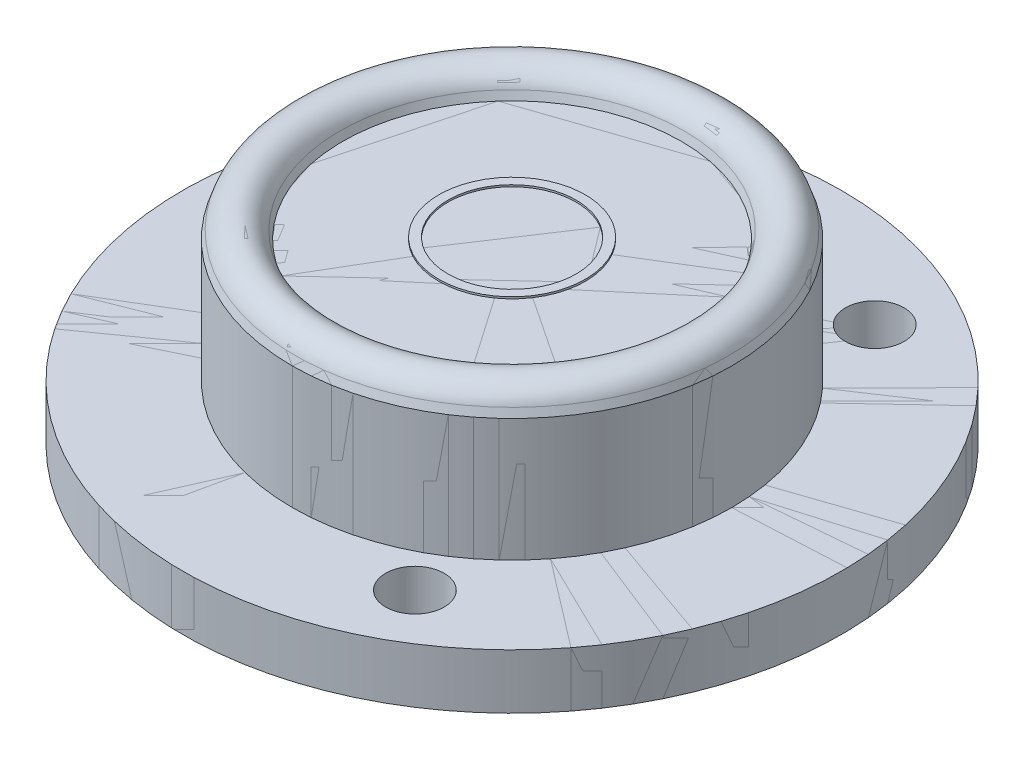
ISO-10303-21;
HEADER;
FILE_DESCRIPTION(('STEP AP214'),'2;1');
FILE_NAME('part.step','',(''),(''),'','','');
FILE_SCHEMA(('AUTOMOTIVE_DESIGN { 1 0 10303 214 1 1 1 1 }'));
ENDSEC;
DATA;
#1=APPLICATION_CONTEXT('core data for automotive mechanical design processes');
#2=APPLICATION_PROTOCOL_DEFINITION('international standard','automotive_design',2000,#1);
#3=PRODUCT_CONTEXT('',#1,'mechanical');
#4=PRODUCT('Part','Part','',(#3));
#5=PRODUCT_RELATED_PRODUCT_CATEGORY('part','',(#4));
#6=PRODUCT_DEFINITION_FORMATION('','',#4);
#7=PRODUCT_DEFINITION_CONTEXT('part definition',#1,'design');
#8=PRODUCT_DEFINITION('design','',#6,#7);
#9=PRODUCT_DEFINITION_SHAPE('','',#8);
#10=(LENGTH_UNIT() NAMED_UNIT(*) SI_UNIT(.MILLI.,.METRE.));
#11=(NAMED_UNIT(*) PLANE_ANGLE_UNIT() SI_UNIT($,.RADIAN.));
#12=(NAMED_UNIT(*) SI_UNIT($,.STERADIAN.) SOLID_ANGLE_UNIT());
#13=UNCERTAINTY_MEASURE_WITH_UNIT(LENGTH_MEASURE(1.E-05),#10,'distance_accuracy_value','');
#14=(GEOMETRIC_REPRESENTATION_CONTEXT(3) GLOBAL_UNCERTAINTY_ASSIGNED_CONTEXT((#13)) GLOBAL_UNIT_ASSIGNED_CONTEXT((#10,
#11,#12)) REPRESENTATION_CONTEXT('',''));
#15=CARTESIAN_POINT('',(0.,0.,0.));
#16=DIRECTION('',(0.,0.,1.));
#17=DIRECTION('',(1.,0.,0.));
#18=AXIS2_PLACEMENT_3D('',#15,#16,#17);
#19=CARTESIAN_POINT('',(7.25,3.,-12.5573683548744));
#20=DIRECTION('',(0.,-1.,0.));
#21=DIRECTION('',(0.866025403784439,0.,0.5));
#22=AXIS2_PLACEMENT_3D('',#19,#20,#21);
#23=CYLINDRICAL_SURFACE('',#22,1.6);
#24=CARTESIAN_POINT('',(7.25,0.,-12.5573683548744));
#25=DIRECTION('',(0.,1.,0.));
#26=DIRECTION('',(-0.5,0.,0.866025403784439));
#27=AXIS2_PLACEMENT_3D('',#24,#25,#26);
#28=CIRCLE('',#27,1.6);
#29=CARTESIAN_POINT('',(6.45,0.,-11.1717277088193));
#30=VERTEX_POINT('',#29);
#31=EDGE_CURVE('P0_E243',#30,#30,#28,.T.);
#32=ORIENTED_EDGE('',*,*,#31,.F.);
#33=EDGE_LOOP('',(#32));
#34=FACE_BOUND('',#33,.T.);
#35=CARTESIAN_POINT('',(7.25,3.,-12.5573683548744));
#36=DIRECTION('',(0.,1.,0.));
#37=DIRECTION('',(-0.5,0.,0.866025403784439));
#38=AXIS2_PLACEMENT_3D('',#35,#36,#37);
#39=CIRCLE('',#38,1.6);
#40=CARTESIAN_POINT('',(6.45,3.,-11.1717277088193));
#41=VERTEX_POINT('',#40);
#42=EDGE_CURVE('P0_E230',#41,#41,#39,.T.);
#43=ORIENTED_EDGE('',*,*,#42,.T.);
#44=EDGE_LOOP('',(#43));
#45=FACE_BOUND('',#44,.T.);
#46=ADVANCED_FACE('P0_F52',(#34,#45),#23,.F.);
#47=CARTESIAN_POINT('',(7.25,3.,12.5573683548744));
#48=DIRECTION('',(0.,-1.,0.));
#49=DIRECTION('',(-0.866025403784439,0.,0.5));
#50=AXIS2_PLACEMENT_3D('',#47,#48,#49);
#51=CYLINDRICAL_SURFACE('',#50,1.6);
#52=CARTESIAN_POINT('',(7.25,0.,12.5573683548744));
#53=DIRECTION('',(0.,1.,0.));
#54=DIRECTION('',(-0.5,0.,-0.866025403784439));
#55=AXIS2_PLACEMENT_3D('',#52,#53,#54);
#56=CIRCLE('',#55,1.6);
#57=CARTESIAN_POINT('',(6.45,0.,11.1717277088193));
#58=VERTEX_POINT('',#57);
#59=EDGE_CURVE('P0_E118',#58,#58,#56,.T.);
#60=ORIENTED_EDGE('',*,*,#59,.F.);
#61=EDGE_LOOP('',(#60));
#62=FACE_BOUND('',#61,.T.);
#63=CARTESIAN_POINT('',(7.25,3.,12.5573683548744));
#64=DIRECTION('',(0.,1.,0.));
#65=DIRECTION('',(-0.5,0.,-0.866025403784439));
#66=AXIS2_PLACEMENT_3D('',#63,#64,#65);
#67=CIRCLE('',#66,1.6);
#68=CARTESIAN_POINT('',(6.45,3.,11.1717277088193));
#69=VERTEX_POINT('',#68);
#70=EDGE_CURVE('P0_E235',#69,#69,#67,.T.);
#71=ORIENTED_EDGE('',*,*,#70,.T.);
#72=EDGE_LOOP('',(#71));
#73=FACE_BOUND('',#72,.T.);
#74=ADVANCED_FACE('P0_F198',(#62,#73),#51,.F.);
#75=CARTESIAN_POINT('',(-14.5,3.,0.));
#76=DIRECTION('',(0.,-1.,0.));
#77=DIRECTION('',(0.,0.,-1.));
#78=AXIS2_PLACEMENT_3D('',#75,#76,#77);
#79=CYLINDRICAL_SURFACE('',#78,1.6);
#80=CARTESIAN_POINT('',(-14.5,0.,0.));
#81=DIRECTION('',(0.,1.,0.));
#82=DIRECTION('',(1.,0.,0.));
#83=AXIS2_PLACEMENT_3D('',#80,#81,#82);
#84=CIRCLE('',#83,1.6);
#85=CARTESIAN_POINT('',(-12.9,0.,0.));
#86=VERTEX_POINT('',#85);
#87=EDGE_CURVE('P0_E114',#86,#86,#84,.T.);
#88=ORIENTED_EDGE('',*,*,#87,.F.);
#89=EDGE_LOOP('',(#88));
#90=FACE_BOUND('',#89,.T.);
#91=CARTESIAN_POINT('',(-14.5,3.,0.));
#92=DIRECTION('',(0.,1.,0.));
#93=DIRECTION('',(1.,0.,0.));
#94=AXIS2_PLACEMENT_3D('',#91,#92,#93);
#95=CIRCLE('',#94,1.6);
#96=CARTESIAN_POINT('',(-12.9,3.,0.));
#97=VERTEX_POINT('',#96);
#98=EDGE_CURVE('P0_E242',#97,#97,#95,.T.);
#99=ORIENTED_EDGE('',*,*,#98,.T.);
#100=EDGE_LOOP('',(#99));
#101=FACE_BOUND('',#100,.T.);
#102=ADVANCED_FACE('P0_F168',(#90,#101),#79,.F.);
#103=CARTESIAN_POINT('',(9.25,9.7,0.));
#104=DIRECTION('',(0.,1.,0.));
#105=DIRECTION('',(1.,0.,0.));
#106=AXIS2_PLACEMENT_3D('',#103,#104,#105);
#107=PLANE('',#106);
#108=CARTESIAN_POINT('',(0.,9.7,0.));
#109=DIRECTION('',(0.,1.,0.));
#110=DIRECTION('',(0.,0.,1.));
#111=AXIS2_PLACEMENT_3D('',#108,#109,#110);
#112=CIRCLE('',#111,4.);
#113=CARTESIAN_POINT('',(0.,9.7,4.));
#114=VERTEX_POINT('',#113);
#115=EDGE_CURVE('P0_E280',#114,#114,#112,.T.);
#116=ORIENTED_EDGE('',*,*,#115,.F.);
#117=EDGE_LOOP('',(#116));
#118=FACE_BOUND('',#117,.T.);
#119=CARTESIAN_POINT('',(0.,9.7,0.));
#120=DIRECTION('',(0.,-1.,0.));
#121=DIRECTION('',(0.,0.,-1.));
#122=AXIS2_PLACEMENT_3D('',#119,#120,#121);
#123=CIRCLE('',#122,9.25);
#124=CARTESIAN_POINT('',(0.,9.7,-9.25));
#125=VERTEX_POINT('',#124);
#126=EDGE_CURVE('P0_E62',#125,#125,#123,.T.);
#127=ORIENTED_EDGE('',*,*,#126,.F.);
#128=EDGE_LOOP('',(#127));
#129=FACE_BOUND('',#128,.T.);
#130=ADVANCED_FACE('P0_F164',(#118,#129),#107,.T.);
#131=CARTESIAN_POINT('',(0.,10.1234802677694,0.));
#132=DIRECTION('',(0.,1.,0.));
#133=DIRECTION('',(0.,0.,1.));
#134=AXIS2_PLACEMENT_3D('',#131,#132,#133);
#135=CONICAL_SURFACE('',#134,9.39590909090909,0.331809173759411);
#136=CARTESIAN_POINT('',(0.,10.1234802677694,0.));
#137=DIRECTION('',(0.,-1.,0.));
#138=DIRECTION('',(0.,0.,-1.));
#139=AXIS2_PLACEMENT_3D('',#136,#137,#138);
#140=CIRCLE('',#139,9.39590909090909);
#141=CARTESIAN_POINT('',(0.,10.1234802677694,-9.39590909090909));
#142=VERTEX_POINT('',#141);
#143=EDGE_CURVE('P0_E107',#142,#142,#140,.T.);
#144=ORIENTED_EDGE('',*,*,#143,.F.);
#145=EDGE_LOOP('',(#144));
#146=FACE_BOUND('',#145,.T.);
#147=ORIENTED_EDGE('',*,*,#126,.T.);
#148=EDGE_LOOP('',(#147));
#149=FACE_BOUND('',#148,.T.);
#150=ADVANCED_FACE('P0_F128',(#146,#149),#135,.F.);
#151=CARTESIAN_POINT('',(0.,9.7,0.));
#152=DIRECTION('',(0.,-1.,0.));
#153=DIRECTION('',(0.,0.,-1.));
#154=AXIS2_PLACEMENT_3D('',#151,#152,#153);
#155=CONICAL_SURFACE('',#154,12.,0.331809173759411);
#156=CARTESIAN_POINT('',(0.,9.7,0.));
#157=DIRECTION('',(0.,-1.,0.));
#158=DIRECTION('',(0.,0.,-1.));
#159=AXIS2_PLACEMENT_3D('',#156,#157,#158);
#160=CIRCLE('',#159,12.);
#161=CARTESIAN_POINT('',(0.,9.7,-12.));
#162=VERTEX_POINT('',#161);
#163=EDGE_CURVE('P0_E229',#162,#162,#160,.T.);
#164=ORIENTED_EDGE('',*,*,#163,.F.);
#165=EDGE_LOOP('',(#164));
#166=FACE_BOUND('',#165,.T.);
#167=CARTESIAN_POINT('',(0.,10.1234802677694,0.));
#168=DIRECTION('',(0.,-1.,0.));
#169=DIRECTION('',(0.,0.,-1.));
#170=AXIS2_PLACEMENT_3D('',#167,#168,#169);
#171=CIRCLE('',#170,11.8540909090909);
#172=CARTESIAN_POINT('',(0.,10.1234802677694,-11.8540909090909));
#173=VERTEX_POINT('',#172);
#174=EDGE_CURVE('P0_E115',#173,#173,#171,.T.);
#175=ORIENTED_EDGE('',*,*,#174,.T.);
#176=EDGE_LOOP('',(#175));
#177=FACE_BOUND('',#176,.T.);
#178=ADVANCED_FACE('P0_F123',(#166,#177),#155,.T.);
#179=CARTESIAN_POINT('',(0.,9.7,0.));
#180=DIRECTION('',(0.,-1.,0.));
#181=DIRECTION('',(0.,0.,-1.));
#182=AXIS2_PLACEMENT_3D('',#179,#180,#181);
#183=TOROIDAL_SURFACE('',#182,10.625,1.3);
#184=ORIENTED_EDGE('',*,*,#174,.F.);
#185=EDGE_LOOP('',(#184));
#186=FACE_BOUND('',#185,.T.);
#187=ORIENTED_EDGE('',*,*,#143,.T.);
#188=EDGE_LOOP('',(#187));
#189=FACE_BOUND('',#188,.T.);
#190=ADVANCED_FACE('P0_F108',(#186,#189),#183,.T.);
#191=CARTESIAN_POINT('',(18.,0.,0.));
#192=DIRECTION('',(0.,1.,0.));
#193=DIRECTION('',(1.,0.,0.));
#194=AXIS2_PLACEMENT_3D('',#191,#192,#193);
#195=PLANE('',#194);
#196=CARTESIAN_POINT('',(0.,0.,0.));
#197=DIRECTION('',(0.,-1.,0.));
#198=DIRECTION('',(0.,0.,-1.));
#199=AXIS2_PLACEMENT_3D('',#196,#197,#198);
#200=CIRCLE('',#199,18.);
#201=CARTESIAN_POINT('',(0.,0.,-18.));
#202=VERTEX_POINT('',#201);
#203=EDGE_CURVE('P0_E245',#202,#202,#200,.T.);
#204=ORIENTED_EDGE('',*,*,#203,.T.);
#205=EDGE_LOOP('',(#204));
#206=FACE_BOUND('',#205,.T.);
#207=ORIENTED_EDGE('',*,*,#87,.T.);
#208=EDGE_LOOP('',(#207));
#209=FACE_BOUND('',#208,.T.);
#210=ORIENTED_EDGE('',*,*,#59,.T.);
#211=EDGE_LOOP('',(#210));
#212=FACE_BOUND('',#211,.T.);
#213=ORIENTED_EDGE('',*,*,#31,.T.);
#214=EDGE_LOOP('',(#213));
#215=FACE_BOUND('',#214,.T.);
#216=ADVANCED_FACE('P0_F136',(#206,#209,#212,#215),#195,.F.);
#217=CARTESIAN_POINT('',(0.,0.,0.));
#218=DIRECTION('',(0.,-1.,0.));
#219=DIRECTION('',(0.,0.,-1.));
#220=AXIS2_PLACEMENT_3D('',#217,#218,#219);
#221=CYLINDRICAL_SURFACE('',#220,18.);
#222=CARTESIAN_POINT('',(0.,3.,0.));
#223=DIRECTION('',(0.,-1.,0.));
#224=DIRECTION('',(0.,0.,-1.));
#225=AXIS2_PLACEMENT_3D('',#222,#223,#224);
#226=CIRCLE('',#225,18.);
#227=CARTESIAN_POINT('',(0.,3.,-18.));
#228=VERTEX_POINT('',#227);
#229=EDGE_CURVE('P0_E224',#228,#228,#226,.T.);
#230=ORIENTED_EDGE('',*,*,#229,.T.);
#231=EDGE_LOOP('',(#230));
#232=FACE_BOUND('',#231,.T.);
#233=ORIENTED_EDGE('',*,*,#203,.F.);
#234=EDGE_LOOP('',(#233));
#235=FACE_BOUND('',#234,.T.);
#236=ADVANCED_FACE('P0_F146',(#232,#235),#221,.T.);
#237=CARTESIAN_POINT('',(12.,3.,0.));
#238=DIRECTION('',(0.,-1.,0.));
#239=DIRECTION('',(0.,0.,-1.));
#240=AXIS2_PLACEMENT_3D('',#237,#238,#239);
#241=PLANE('',#240);
#242=CARTESIAN_POINT('',(0.,3.,0.));
#243=DIRECTION('',(0.,-1.,0.));
#244=DIRECTION('',(0.,0.,-1.));
#245=AXIS2_PLACEMENT_3D('',#242,#243,#244);
#246=CIRCLE('',#245,12.);
#247=CARTESIAN_POINT('',(0.,3.,-12.));
#248=VERTEX_POINT('',#247);
#249=EDGE_CURVE('P0_E233',#248,#248,#246,.T.);
#250=ORIENTED_EDGE('',*,*,#249,.T.);
#251=EDGE_LOOP('',(#250));
#252=FACE_BOUND('',#251,.T.);
#253=ORIENTED_EDGE('',*,*,#98,.F.);
#254=EDGE_LOOP('',(#253));
#255=FACE_BOUND('',#254,.T.);
#256=ORIENTED_EDGE('',*,*,#70,.F.);
#257=EDGE_LOOP('',(#256));
#258=FACE_BOUND('',#257,.T.);
#259=ORIENTED_EDGE('',*,*,#42,.F.);
#260=EDGE_LOOP('',(#259));
#261=FACE_BOUND('',#260,.T.);
#262=ORIENTED_EDGE('',*,*,#229,.F.);
#263=EDGE_LOOP('',(#262));
#264=FACE_BOUND('',#263,.T.);
#265=ADVANCED_FACE('P0_F159',(#252,#255,#258,#261,#264),#241,.F.);
#266=CARTESIAN_POINT('',(0.,0.,0.));
#267=DIRECTION('',(0.,-1.,0.));
#268=DIRECTION('',(0.,0.,-1.));
#269=AXIS2_PLACEMENT_3D('',#266,#267,#268);
#270=CYLINDRICAL_SURFACE('',#269,12.);
#271=ORIENTED_EDGE('',*,*,#163,.T.);
#272=EDGE_LOOP('',(#271));
#273=FACE_BOUND('',#272,.T.);
#274=ORIENTED_EDGE('',*,*,#249,.F.);
#275=EDGE_LOOP('',(#274));
#276=FACE_BOUND('',#275,.T.);
#277=ADVANCED_FACE('P0_F152',(#273,#276),#270,.T.);
#278=CARTESIAN_POINT('',(0.,9.8,0.));
#279=DIRECTION('',(0.,1.,0.));
#280=DIRECTION('',(0.,0.,1.));
#281=AXIS2_PLACEMENT_3D('',#278,#279,#280);
#282=PLANE('',#281);
#283=CARTESIAN_POINT('',(0.,9.8,0.));
#284=DIRECTION('',(0.,1.,0.));
#285=DIRECTION('',(0.,0.,1.));
#286=AXIS2_PLACEMENT_3D('',#283,#284,#285);
#287=CIRCLE('',#286,4.);
#288=CARTESIAN_POINT('',(0.,9.8,4.));
#289=VERTEX_POINT('',#288);
#290=EDGE_CURVE('P0_E277',#289,#289,#287,.T.);
#291=ORIENTED_EDGE('',*,*,#290,.T.);
#292=EDGE_LOOP('',(#291));
#293=FACE_BOUND('',#292,.T.);
#294=CARTESIAN_POINT('',(0.,9.8,0.));
#295=DIRECTION('',(0.,1.,0.));
#296=DIRECTION('',(0.,0.,1.));
#297=AXIS2_PLACEMENT_3D('',#294,#295,#296);
#298=CIRCLE('',#297,3.5);
#299=CARTESIAN_POINT('',(0.,9.8,3.5));
#300=VERTEX_POINT('',#299);
#301=EDGE_CURVE('P0_E278',#300,#300,#298,.T.);
#302=ORIENTED_EDGE('',*,*,#301,.F.);
#303=EDGE_LOOP('',(#302));
#304=FACE_BOUND('',#303,.T.);
#305=ADVANCED_FACE('P0_F157',(#293,#304),#282,.T.);
#306=CARTESIAN_POINT('',(0.,9.8,0.));
#307=DIRECTION('',(0.,-1.,0.));
#308=DIRECTION('',(0.,0.,-1.));
#309=AXIS2_PLACEMENT_3D('',#306,#307,#308);
#310=CYLINDRICAL_SURFACE('',#309,4.);
#311=ORIENTED_EDGE('',*,*,#290,.F.);
#312=EDGE_LOOP('',(#311));
#313=FACE_BOUND('',#312,.T.);
#314=ORIENTED_EDGE('',*,*,#115,.T.);
#315=EDGE_LOOP('',(#314));
#316=FACE_BOUND('',#315,.T.);
#317=ADVANCED_FACE('P0_F288',(#313,#316),#310,.T.);
#318=CARTESIAN_POINT('',(0.,9.8,0.));
#319=DIRECTION('',(0.,-1.,0.));
#320=DIRECTION('',(0.,0.,-1.));
#321=AXIS2_PLACEMENT_3D('',#318,#319,#320);
#322=CYLINDRICAL_SURFACE('',#321,3.5);
#323=ORIENTED_EDGE('',*,*,#301,.T.);
#324=EDGE_LOOP('',(#323));
#325=FACE_BOUND('',#324,.T.);
#326=CARTESIAN_POINT('',(0.,9.7,0.));
#327=DIRECTION('',(0.,1.,0.));
#328=DIRECTION('',(0.,0.,1.));
#329=AXIS2_PLACEMENT_3D('',#326,#327,#328);
#330=CIRCLE('',#329,3.5);
#331=CARTESIAN_POINT('',(0.,9.7,3.5));
#332=VERTEX_POINT('',#331);
#333=EDGE_CURVE('P0_E11',#332,#332,#330,.F.);
#334=ORIENTED_EDGE('',*,*,#333,.T.);
#335=EDGE_LOOP('',(#334));
#336=FACE_BOUND('',#335,.T.);
#337=ADVANCED_FACE('P0_F287',(#325,#336),#322,.F.);
#338=ORIENTED_EDGE('',*,*,#333,.F.);
#339=EDGE_LOOP('',(#338));
#340=FACE_BOUND('',#339,.T.);
#341=ADVANCED_FACE('P0_F174',(#340),#107,.T.);
#342=CLOSED_SHELL('',(#46,#74,#102,#130,#150,#178,#190,#216,#236,#265,#277,#305,#317,#337,#341));
#343=MANIFOLD_SOLID_BREP('P0_B2',#342);
#344=CARTESIAN_POINT('',(7.25,3.,-12.5573683548744));
#345=DIRECTION('',(0.,-1.,0.));
#346=DIRECTION('',(0.866025403784439,0.,0.5));
#347=AXIS2_PLACEMENT_3D('',#344,#345,#346);
#348=CYLINDRICAL_SURFACE('',#347,1.6);
#349=CARTESIAN_POINT('',(7.25,0.,-12.5573683548744));
#350=DIRECTION('',(0.,1.,0.));
#351=DIRECTION('',(-0.5,0.,0.866025403784439));
#352=AXIS2_PLACEMENT_3D('',#349,#350,#351);
#353=CIRCLE('',#352,1.6);
#354=CARTESIAN_POINT('',(6.45,0.,-11.1717277088193));
#355=VERTEX_POINT('',#354);
#356=EDGE_CURVE('P1_E83',#355,#355,#353,.T.);
#357=ORIENTED_EDGE('',*,*,#356,.F.);
#358=EDGE_LOOP('',(#357));
#359=FACE_BOUND('',#358,.T.);
#360=CARTESIAN_POINT('',(7.25,3.,-12.5573683548744));
#361=DIRECTION('',(0.,1.,0.));
#362=DIRECTION('',(-0.5,0.,0.866025403784439));
#363=AXIS2_PLACEMENT_3D('',#360,#361,#362);
#364=CIRCLE('',#363,1.6);
#365=CARTESIAN_POINT('',(6.45,3.,-11.1717277088193));
#366=VERTEX_POINT('',#365);
#367=EDGE_CURVE('P1_E98',#366,#366,#364,.T.);
#368=ORIENTED_EDGE('',*,*,#367,.T.);
#369=EDGE_LOOP('',(#368));
#370=FACE_BOUND('',#369,.T.);
#371=ADVANCED_FACE('P1_F16',(#359,#370),#348,.F.);
#372=CARTESIAN_POINT('',(7.25,3.,12.5573683548744));
#373=DIRECTION('',(0.,-1.,0.));
#374=DIRECTION('',(-0.866025403784439,0.,0.5));
#375=AXIS2_PLACEMENT_3D('',#372,#373,#374);
#376=CYLINDRICAL_SURFACE('',#375,1.6);
#377=CARTESIAN_POINT('',(7.25,0.,12.5573683548744));
#378=DIRECTION('',(0.,1.,0.));
#379=DIRECTION('',(-0.5,0.,-0.866025403784439));
#380=AXIS2_PLACEMENT_3D('',#377,#378,#379);
#381=CIRCLE('',#380,1.6);
#382=CARTESIAN_POINT('',(6.45,0.,11.1717277088193));
#383=VERTEX_POINT('',#382);
#384=EDGE_CURVE('P1_E82',#383,#383,#381,.T.);
#385=ORIENTED_EDGE('',*,*,#384,.F.);
#386=EDGE_LOOP('',(#385));
#387=FACE_BOUND('',#386,.T.);
#388=CARTESIAN_POINT('',(7.25,3.,12.5573683548744));
#389=DIRECTION('',(0.,1.,0.));
#390=DIRECTION('',(-0.5,0.,-0.866025403784439));
#391=AXIS2_PLACEMENT_3D('',#388,#389,#390);
#392=CIRCLE('',#391,1.6);
#393=CARTESIAN_POINT('',(6.45,3.,11.1717277088193));
#394=VERTEX_POINT('',#393);
#395=EDGE_CURVE('P1_E91',#394,#394,#392,.T.);
#396=ORIENTED_EDGE('',*,*,#395,.T.);
#397=EDGE_LOOP('',(#396));
#398=FACE_BOUND('',#397,.T.);
#399=ADVANCED_FACE('P1_F134',(#387,#398),#376,.F.);
#400=CARTESIAN_POINT('',(-14.5,3.,0.));
#401=DIRECTION('',(0.,-1.,0.));
#402=DIRECTION('',(0.,0.,-1.));
#403=AXIS2_PLACEMENT_3D('',#400,#401,#402);
#404=CYLINDRICAL_SURFACE('',#403,1.6);
#405=CARTESIAN_POINT('',(-14.5,0.,0.));
#406=DIRECTION('',(0.,1.,0.));
#407=DIRECTION('',(1.,0.,0.));
#408=AXIS2_PLACEMENT_3D('',#405,#406,#407);
#409=CIRCLE('',#408,1.6);
#410=CARTESIAN_POINT('',(-12.9,0.,0.));
#411=VERTEX_POINT('',#410);
#412=EDGE_CURVE('P1_E76',#411,#411,#409,.T.);
#413=ORIENTED_EDGE('',*,*,#412,.F.);
#414=EDGE_LOOP('',(#413));
#415=FACE_BOUND('',#414,.T.);
#416=CARTESIAN_POINT('',(-14.5,3.,0.));
#417=DIRECTION('',(0.,1.,0.));
#418=DIRECTION('',(1.,0.,0.));
#419=AXIS2_PLACEMENT_3D('',#416,#417,#418);
#420=CIRCLE('',#419,1.6);
#421=CARTESIAN_POINT('',(-12.9,3.,0.));
#422=VERTEX_POINT('',#421);
#423=EDGE_CURVE('P1_E89',#422,#422,#420,.T.);
#424=ORIENTED_EDGE('',*,*,#423,.T.);
#425=EDGE_LOOP('',(#424));
#426=FACE_BOUND('',#425,.T.);
#427=ADVANCED_FACE('P1_F138',(#415,#426),#404,.F.);
#428=CARTESIAN_POINT('',(9.25,9.7,0.));
#429=DIRECTION('',(0.,1.,0.));
#430=DIRECTION('',(1.,0.,0.));
#431=AXIS2_PLACEMENT_3D('',#428,#429,#430);
#432=PLANE('',#431);
#433=CARTESIAN_POINT('',(0.,9.7,0.));
#434=DIRECTION('',(0.,-1.,0.));
#435=DIRECTION('',(0.,0.,-1.));
#436=AXIS2_PLACEMENT_3D('',#433,#434,#435);
#437=CIRCLE('',#436,9.25);
#438=CARTESIAN_POINT('',(0.,9.7,-9.25));
#439=VERTEX_POINT('',#438);
#440=EDGE_CURVE('P1_E11',#439,#439,#437,.T.);
#441=ORIENTED_EDGE('',*,*,#440,.F.);
#442=EDGE_LOOP('',(#441));
#443=FACE_BOUND('',#442,.T.);
#444=ADVANCED_FACE('P1_F169',(#443),#432,.T.);
#445=CARTESIAN_POINT('',(0.,10.1234802677694,0.));
#446=DIRECTION('',(0.,1.,0.));
#447=DIRECTION('',(0.,0.,1.));
#448=AXIS2_PLACEMENT_3D('',#445,#446,#447);
#449=CONICAL_SURFACE('',#448,9.39590909090909,0.331809173759411);
#450=CARTESIAN_POINT('',(0.,10.1234802677694,0.));
#451=DIRECTION('',(0.,-1.,0.));
#452=DIRECTION('',(0.,0.,-1.));
#453=AXIS2_PLACEMENT_3D('',#450,#451,#452);
#454=CIRCLE('',#453,9.39590909090909);
#455=CARTESIAN_POINT('',(0.,10.1234802677694,-9.39590909090909));
#456=VERTEX_POINT('',#455);
#457=EDGE_CURVE('P1_E71',#456,#456,#454,.T.);
#458=ORIENTED_EDGE('',*,*,#457,.F.);
#459=EDGE_LOOP('',(#458));
#460=FACE_BOUND('',#459,.T.);
#461=ORIENTED_EDGE('',*,*,#440,.T.);
#462=EDGE_LOOP('',(#461));
#463=FACE_BOUND('',#462,.T.);
#464=ADVANCED_FACE('P1_F173',(#460,#463),#449,.F.);
#465=CARTESIAN_POINT('',(0.,9.7,0.));
#466=DIRECTION('',(0.,-1.,0.));
#467=DIRECTION('',(0.,0.,-1.));
#468=AXIS2_PLACEMENT_3D('',#465,#466,#467);
#469=CONICAL_SURFACE('',#468,12.,0.331809173759411);
#470=CARTESIAN_POINT('',(0.,9.7,0.));
#471=DIRECTION('',(0.,-1.,0.));
#472=DIRECTION('',(0.,0.,-1.));
#473=AXIS2_PLACEMENT_3D('',#470,#471,#472);
#474=CIRCLE('',#473,12.);
#475=CARTESIAN_POINT('',(0.,9.7,-12.));
#476=VERTEX_POINT('',#475);
#477=EDGE_CURVE('P1_E104',#476,#476,#474,.T.);
#478=ORIENTED_EDGE('',*,*,#477,.F.);
#479=EDGE_LOOP('',(#478));
#480=FACE_BOUND('',#479,.T.);
#481=CARTESIAN_POINT('',(0.,10.1234802677694,0.));
#482=DIRECTION('',(0.,-1.,0.));
#483=DIRECTION('',(0.,0.,-1.));
#484=AXIS2_PLACEMENT_3D('',#481,#482,#483);
#485=CIRCLE('',#484,11.8540909090909);
#486=CARTESIAN_POINT('',(0.,10.1234802677694,-11.8540909090909));
#487=VERTEX_POINT('',#486);
#488=EDGE_CURVE('P1_E25',#487,#487,#485,.T.);
#489=ORIENTED_EDGE('',*,*,#488,.T.);
#490=EDGE_LOOP('',(#489));
#491=FACE_BOUND('',#490,.T.);
#492=ADVANCED_FACE('P1_F179',(#480,#491),#469,.T.);
#493=CARTESIAN_POINT('',(0.,9.7,0.));
#494=DIRECTION('',(0.,-1.,0.));
#495=DIRECTION('',(0.,0.,-1.));
#496=AXIS2_PLACEMENT_3D('',#493,#494,#495);
#497=TOROIDAL_SURFACE('',#496,10.625,1.3);
#498=ORIENTED_EDGE('',*,*,#488,.F.);
#499=EDGE_LOOP('',(#498));
#500=FACE_BOUND('',#499,.T.);
#501=ORIENTED_EDGE('',*,*,#457,.T.);
#502=EDGE_LOOP('',(#501));
#503=FACE_BOUND('',#502,.T.);
#504=ADVANCED_FACE('P1_F73',(#500,#503),#497,.T.);
#505=CARTESIAN_POINT('',(18.,0.,0.));
#506=DIRECTION('',(0.,1.,0.));
#507=DIRECTION('',(1.,0.,0.));
#508=AXIS2_PLACEMENT_3D('',#505,#506,#507);
#509=PLANE('',#508);
#510=CARTESIAN_POINT('',(0.,0.,0.));
#511=DIRECTION('',(0.,-1.,0.));
#512=DIRECTION('',(0.,0.,-1.));
#513=AXIS2_PLACEMENT_3D('',#510,#511,#512);
#514=CIRCLE('',#513,18.);
#515=CARTESIAN_POINT('',(0.,0.,-18.));
#516=VERTEX_POINT('',#515);
#517=EDGE_CURVE('P1_E90',#516,#516,#514,.T.);
#518=ORIENTED_EDGE('',*,*,#517,.T.);
#519=EDGE_LOOP('',(#518));
#520=FACE_BOUND('',#519,.T.);
#521=ORIENTED_EDGE('',*,*,#412,.T.);
#522=EDGE_LOOP('',(#521));
#523=FACE_BOUND('',#522,.T.);
#524=ORIENTED_EDGE('',*,*,#384,.T.);
#525=EDGE_LOOP('',(#524));
#526=FACE_BOUND('',#525,.T.);
#527=ORIENTED_EDGE('',*,*,#356,.T.);
#528=EDGE_LOOP('',(#527));
#529=FACE_BOUND('',#528,.T.);
#530=ADVANCED_FACE('P1_F155',(#520,#523,#526,#529),#509,.F.);
#531=CARTESIAN_POINT('',(0.,0.,0.));
#532=DIRECTION('',(0.,-1.,0.));
#533=DIRECTION('',(0.,0.,-1.));
#534=AXIS2_PLACEMENT_3D('',#531,#532,#533);
#535=CYLINDRICAL_SURFACE('',#534,18.);
#536=CARTESIAN_POINT('',(0.,3.,0.));
#537=DIRECTION('',(0.,-1.,0.));
#538=DIRECTION('',(0.,0.,-1.));
#539=AXIS2_PLACEMENT_3D('',#536,#537,#538);
#540=CIRCLE('',#539,18.);
#541=CARTESIAN_POINT('',(0.,3.,-18.));
#542=VERTEX_POINT('',#541);
#543=EDGE_CURVE('P1_E101',#542,#542,#540,.T.);
#544=ORIENTED_EDGE('',*,*,#543,.T.);
#545=EDGE_LOOP('',(#544));
#546=FACE_BOUND('',#545,.T.);
#547=ORIENTED_EDGE('',*,*,#517,.F.);
#548=EDGE_LOOP('',(#547));
#549=FACE_BOUND('',#548,.T.);
#550=ADVANCED_FACE('P1_F129',(#546,#549),#535,.T.);
#551=CARTESIAN_POINT('',(12.,3.,0.));
#552=DIRECTION('',(0.,-1.,0.));
#553=DIRECTION('',(0.,0.,-1.));
#554=AXIS2_PLACEMENT_3D('',#551,#552,#553);
#555=PLANE('',#554);
#556=CARTESIAN_POINT('',(0.,3.,0.));
#557=DIRECTION('',(0.,-1.,0.));
#558=DIRECTION('',(0.,0.,-1.));
#559=AXIS2_PLACEMENT_3D('',#556,#557,#558);
#560=CIRCLE('',#559,12.);
#561=CARTESIAN_POINT('',(0.,3.,-12.));
#562=VERTEX_POINT('',#561);
#563=EDGE_CURVE('P1_E108',#562,#562,#560,.T.);
#564=ORIENTED_EDGE('',*,*,#563,.T.);
#565=EDGE_LOOP('',(#564));
#566=FACE_BOUND('',#565,.T.);
#567=ORIENTED_EDGE('',*,*,#423,.F.);
#568=EDGE_LOOP('',(#567));
#569=FACE_BOUND('',#568,.T.);
#570=ORIENTED_EDGE('',*,*,#395,.F.);
#571=EDGE_LOOP('',(#570));
#572=FACE_BOUND('',#571,.T.);
#573=ORIENTED_EDGE('',*,*,#367,.F.);
#574=EDGE_LOOP('',(#573));
#575=FACE_BOUND('',#574,.T.);
#576=ORIENTED_EDGE('',*,*,#543,.F.);
#577=EDGE_LOOP('',(#576));
#578=FACE_BOUND('',#577,.T.);
#579=ADVANCED_FACE('P1_F116',(#566,#569,#572,#575,#578),#555,.F.);
#580=CARTESIAN_POINT('',(0.,0.,0.));
#581=DIRECTION('',(0.,-1.,0.));
#582=DIRECTION('',(0.,0.,-1.));
#583=AXIS2_PLACEMENT_3D('',#580,#581,#582);
#584=CYLINDRICAL_SURFACE('',#583,12.);
#585=ORIENTED_EDGE('',*,*,#477,.T.);
#586=EDGE_LOOP('',(#585));
#587=FACE_BOUND('',#586,.T.);
#588=ORIENTED_EDGE('',*,*,#563,.F.);
#589=EDGE_LOOP('',(#588));
#590=FACE_BOUND('',#589,.T.);
#591=ADVANCED_FACE('P1_F125',(#587,#590),#584,.T.);
#592=CLOSED_SHELL('',(#371,#399,#427,#444,#464,#492,#504,#530,#550,#579,#591));
#593=MANIFOLD_SOLID_BREP('P1_B1',#592);
#594=ADVANCED_BREP_SHAPE_REPRESENTATION('',(#18,#343,#593),#14);
#595=SHAPE_DEFINITION_REPRESENTATION(#9,#594);
ENDSEC;
END-ISO-10303-21;
